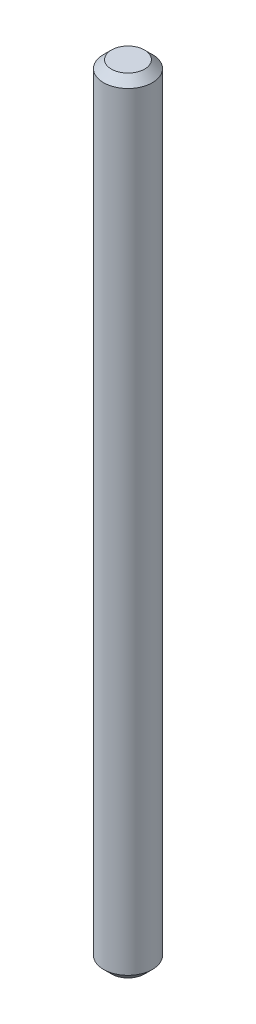
ISO-10303-21;
HEADER;
FILE_DESCRIPTION(('STEP AP214'),'2;1');
FILE_NAME('part.step','',(''),(''),'','','');
FILE_SCHEMA(('AUTOMOTIVE_DESIGN { 1 0 10303 214 1 1 1 1 }'));
ENDSEC;
DATA;
#1=APPLICATION_CONTEXT('core data for automotive mechanical design processes');
#2=APPLICATION_PROTOCOL_DEFINITION('international standard','automotive_design',2000,#1);
#3=PRODUCT_CONTEXT('',#1,'mechanical');
#4=PRODUCT('Part','Part','',(#3));
#5=PRODUCT_RELATED_PRODUCT_CATEGORY('part','',(#4));
#6=PRODUCT_DEFINITION_FORMATION('','',#4);
#7=PRODUCT_DEFINITION_CONTEXT('part definition',#1,'design');
#8=PRODUCT_DEFINITION('design','',#6,#7);
#9=PRODUCT_DEFINITION_SHAPE('','',#8);
#10=(LENGTH_UNIT() NAMED_UNIT(*) SI_UNIT(.MILLI.,.METRE.));
#11=(NAMED_UNIT(*) PLANE_ANGLE_UNIT() SI_UNIT($,.RADIAN.));
#12=(NAMED_UNIT(*) SI_UNIT($,.STERADIAN.) SOLID_ANGLE_UNIT());
#13=UNCERTAINTY_MEASURE_WITH_UNIT(LENGTH_MEASURE(1.E-05),#10,'distance_accuracy_value','');
#14=(GEOMETRIC_REPRESENTATION_CONTEXT(3) GLOBAL_UNCERTAINTY_ASSIGNED_CONTEXT((#13)) GLOBAL_UNIT_ASSIGNED_CONTEXT((#10,
#11,#12)) REPRESENTATION_CONTEXT('',''));
#15=CARTESIAN_POINT('',(0.,0.,0.));
#16=DIRECTION('',(0.,0.,1.));
#17=DIRECTION('',(1.,0.,0.));
#18=AXIS2_PLACEMENT_3D('',#15,#16,#17);
#19=CARTESIAN_POINT('',(-1.10176503047921E-13,0.507999999999994,0.));
#20=DIRECTION('',(0.,1.,0.));
#21=DIRECTION('',(-1.,0.,0.));
#22=AXIS2_PLACEMENT_3D('',#19,#20,#21);
#23=CONICAL_SURFACE('',#22,1.58368999999341,0.785398163397448);
#24=CARTESIAN_POINT('',(-1.10176503047921E-13,0.,0.));
#25=DIRECTION('',(0.,1.,0.));
#26=DIRECTION('',(-1.,0.,0.));
#27=AXIS2_PLACEMENT_3D('',#24,#25,#26);
#28=CIRCLE('',#27,1.07568999999341);
#29=CARTESIAN_POINT('',(-1.07568999999352,0.,0.));
#30=VERTEX_POINT('',#29);
#31=EDGE_CURVE('E44',#30,#30,#28,.T.);
#32=ORIENTED_EDGE('',*,*,#31,.T.);
#33=EDGE_LOOP('',(#32));
#34=FACE_BOUND('',#33,.T.);
#35=CARTESIAN_POINT('',(-1.10176503047921E-13,0.507999999999994,0.));
#36=DIRECTION('',(0.,1.,0.));
#37=DIRECTION('',(-1.,0.,0.));
#38=AXIS2_PLACEMENT_3D('',#35,#36,#37);
#39=CIRCLE('',#38,1.58368999999341);
#40=CARTESIAN_POINT('',(-1.58368999999352,0.507999999999994,0.));
#41=VERTEX_POINT('',#40);
#42=EDGE_CURVE('E10',#41,#41,#39,.T.);
#43=ORIENTED_EDGE('',*,*,#42,.F.);
#44=EDGE_LOOP('',(#43));
#45=FACE_BOUND('',#44,.T.);
#46=ADVANCED_FACE('F30',(#34,#45),#23,.T.);
#47=CARTESIAN_POINT('',(-1.10176503047921E-13,0.,0.));
#48=DIRECTION('',(0.,1.,0.));
#49=DIRECTION('',(-1.,0.,0.));
#50=AXIS2_PLACEMENT_3D('',#47,#48,#49);
#51=CYLINDRICAL_SURFACE('',#50,1.58368999999341);
#52=ORIENTED_EDGE('',*,*,#42,.T.);
#53=EDGE_LOOP('',(#52));
#54=FACE_BOUND('',#53,.T.);
#55=CARTESIAN_POINT('',(-1.1017650304792E-13,50.292,0.));
#56=DIRECTION('',(0.,1.,0.));
#57=DIRECTION('',(-1.,0.,0.));
#58=AXIS2_PLACEMENT_3D('',#55,#56,#57);
#59=CIRCLE('',#58,1.58368999999341);
#60=CARTESIAN_POINT('',(-1.58368999999352,50.292,0.));
#61=VERTEX_POINT('',#60);
#62=EDGE_CURVE('E36',#61,#61,#59,.T.);
#63=ORIENTED_EDGE('',*,*,#62,.F.);
#64=EDGE_LOOP('',(#63));
#65=FACE_BOUND('',#64,.T.);
#66=ADVANCED_FACE('F63',(#54,#65),#51,.T.);
#67=CARTESIAN_POINT('',(-1.1017650304792E-13,50.7999999999905,0.));
#68=DIRECTION('',(0.,-1.,0.));
#69=DIRECTION('',(1.,0.,0.));
#70=AXIS2_PLACEMENT_3D('',#67,#68,#69);
#71=CONICAL_SURFACE('',#70,1.07569000000287,0.785398163397446);
#72=ORIENTED_EDGE('',*,*,#62,.T.);
#73=EDGE_LOOP('',(#72));
#74=FACE_BOUND('',#73,.T.);
#75=CARTESIAN_POINT('',(-1.1017650304792E-13,50.7999999999905,0.));
#76=DIRECTION('',(0.,1.,0.));
#77=DIRECTION('',(-1.,0.,0.));
#78=AXIS2_PLACEMENT_3D('',#75,#76,#77);
#79=CIRCLE('',#78,1.07569000000287);
#80=CARTESIAN_POINT('',(-1.07569000000298,50.7999999999905,0.));
#81=VERTEX_POINT('',#80);
#82=EDGE_CURVE('E40',#81,#81,#79,.T.);
#83=ORIENTED_EDGE('',*,*,#82,.F.);
#84=EDGE_LOOP('',(#83));
#85=FACE_BOUND('',#84,.T.);
#86=ADVANCED_FACE('F59',(#74,#85),#71,.T.);
#87=CARTESIAN_POINT('',(-1.1017650304792E-13,50.7999999999905,0.));
#88=DIRECTION('',(0.,1.,0.));
#89=DIRECTION('',(-1.,0.,0.));
#90=AXIS2_PLACEMENT_3D('',#87,#88,#89);
#91=PLANE('',#90);
#92=ORIENTED_EDGE('',*,*,#82,.T.);
#93=EDGE_LOOP('',(#92));
#94=FACE_BOUND('',#93,.T.);
#95=ADVANCED_FACE('F54',(#94),#91,.T.);
#96=CARTESIAN_POINT('',(1.0756899999933,0.,0.));
#97=DIRECTION('',(0.,-1.,0.));
#98=DIRECTION('',(1.,0.,0.));
#99=AXIS2_PLACEMENT_3D('',#96,#97,#98);
#100=PLANE('',#99);
#101=ORIENTED_EDGE('',*,*,#31,.F.);
#102=EDGE_LOOP('',(#101));
#103=FACE_BOUND('',#102,.T.);
#104=ADVANCED_FACE('F52',(#103),#100,.T.);
#105=CLOSED_SHELL('',(#46,#66,#86,#95,#104));
#106=MANIFOLD_SOLID_BREP('B2',#105);
#107=ADVANCED_BREP_SHAPE_REPRESENTATION('',(#18,#106),#14);
#108=SHAPE_DEFINITION_REPRESENTATION(#9,#107);
ENDSEC;
END-ISO-10303-21;
